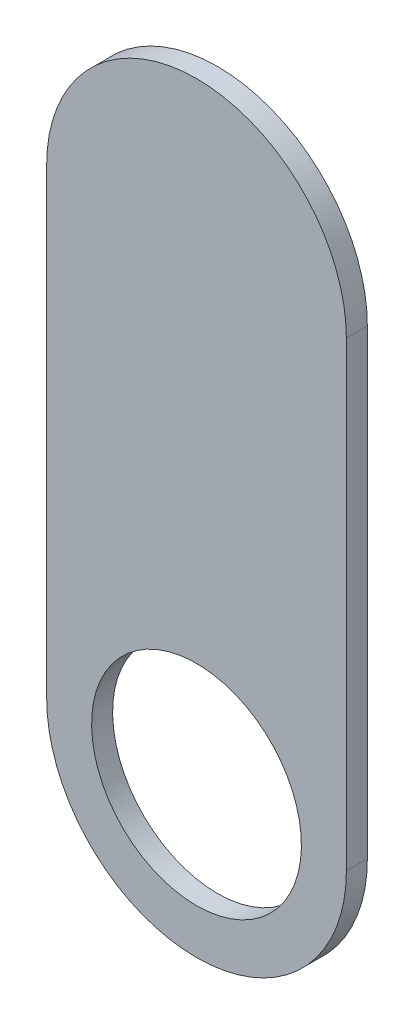
ISO-10303-21;
HEADER;
FILE_DESCRIPTION(('STEP AP214'),'2;1');
FILE_NAME('part.step','',(''),(''),'','','');
FILE_SCHEMA(('AUTOMOTIVE_DESIGN { 1 0 10303 214 1 1 1 1 }'));
ENDSEC;
DATA;
#1=APPLICATION_CONTEXT('core data for automotive mechanical design processes');
#2=APPLICATION_PROTOCOL_DEFINITION('international standard','automotive_design',2000,#1);
#3=PRODUCT_CONTEXT('',#1,'mechanical');
#4=PRODUCT('Part','Part','',(#3));
#5=PRODUCT_RELATED_PRODUCT_CATEGORY('part','',(#4));
#6=PRODUCT_DEFINITION_FORMATION('','',#4);
#7=PRODUCT_DEFINITION_CONTEXT('part definition',#1,'design');
#8=PRODUCT_DEFINITION('design','',#6,#7);
#9=PRODUCT_DEFINITION_SHAPE('','',#8);
#10=(LENGTH_UNIT() NAMED_UNIT(*) SI_UNIT(.MILLI.,.METRE.));
#11=(NAMED_UNIT(*) PLANE_ANGLE_UNIT() SI_UNIT($,.RADIAN.));
#12=(NAMED_UNIT(*) SI_UNIT($,.STERADIAN.) SOLID_ANGLE_UNIT());
#13=UNCERTAINTY_MEASURE_WITH_UNIT(LENGTH_MEASURE(1.E-05),#10,'distance_accuracy_value','');
#14=(GEOMETRIC_REPRESENTATION_CONTEXT(3) GLOBAL_UNCERTAINTY_ASSIGNED_CONTEXT((#13)) GLOBAL_UNIT_ASSIGNED_CONTEXT((#10,
#11,#12)) REPRESENTATION_CONTEXT('',''));
#15=CARTESIAN_POINT('',(0.,0.,0.));
#16=DIRECTION('',(0.,0.,1.));
#17=DIRECTION('',(1.,0.,0.));
#18=AXIS2_PLACEMENT_3D('',#15,#16,#17);
#19=CARTESIAN_POINT('',(107.76,-108.63,-0.045));
#20=DIRECTION('',(0.,0.,-1.));
#21=DIRECTION('',(0.,-1.,0.));
#22=AXIS2_PLACEMENT_3D('',#19,#20,#21);
#23=CYLINDRICAL_SURFACE('',#22,0.175);
#24=CARTESIAN_POINT('',(107.76,-108.63,1.6));
#25=DIRECTION('',(0.,0.,-1.));
#26=DIRECTION('',(0.,-1.,0.));
#27=AXIS2_PLACEMENT_3D('',#24,#25,#26);
#28=CIRCLE('',#27,0.175);
#29=CARTESIAN_POINT('',(107.76,-108.805,1.6));
#30=VERTEX_POINT('',#29);
#31=EDGE_CURVE('E116',#30,#30,#28,.T.);
#32=ORIENTED_EDGE('',*,*,#31,.T.);
#33=DIRECTION('',(0.,0.,1.));
#34=VECTOR('',#33,1.);
#35=CARTESIAN_POINT('',(107.76,-108.805,-0.045));
#36=LINE('',#35,#34);
#37=CARTESIAN_POINT('',(107.76,-108.805,1.635));
#38=VERTEX_POINT('',#37);
#39=EDGE_CURVE('E11',#30,#38,#36,.T.);
#40=ORIENTED_EDGE('',*,*,#39,.T.);
#41=CARTESIAN_POINT('',(107.76,-108.63,1.635));
#42=DIRECTION('',(0.,0.,-1.));
#43=DIRECTION('',(0.,-1.,0.));
#44=AXIS2_PLACEMENT_3D('',#41,#42,#43);
#45=CIRCLE('',#44,0.175);
#46=EDGE_CURVE('E25',#38,#38,#45,.T.);
#47=ORIENTED_EDGE('',*,*,#46,.F.);
#48=ORIENTED_EDGE('',*,*,#39,.F.);
#49=EDGE_LOOP('',(#32,#40,#47,#48));
#50=FACE_BOUND('',#49,.T.);
#51=ADVANCED_FACE('F17',(#50),#23,.F.);
#52=CARTESIAN_POINT('',(107.51,-107.86,1.6));
#53=DIRECTION('',(1.,0.,0.));
#54=DIRECTION('',(0.,1.,0.));
#55=AXIS2_PLACEMENT_3D('',#52,#53,#54);
#56=PLANE('',#55);
#57=DIRECTION('',(0.,-1.,0.));
#58=VECTOR('',#57,1.);
#59=CARTESIAN_POINT('',(107.51,-107.86,1.6));
#60=LINE('',#59,#58);
#61=CARTESIAN_POINT('',(107.51,-107.86,1.6));
#62=VERTEX_POINT('',#61);
#63=CARTESIAN_POINT('',(107.51,-108.63,1.6));
#64=VERTEX_POINT('',#63);
#65=EDGE_CURVE('E114',#62,#64,#60,.T.);
#66=ORIENTED_EDGE('',*,*,#65,.T.);
#67=DIRECTION('',(0.,0.,1.));
#68=VECTOR('',#67,1.);
#69=CARTESIAN_POINT('',(107.51,-108.63,1.6));
#70=LINE('',#69,#68);
#71=CARTESIAN_POINT('',(107.51,-108.63,1.635));
#72=VERTEX_POINT('',#71);
#73=EDGE_CURVE('E83',#64,#72,#70,.T.);
#74=ORIENTED_EDGE('',*,*,#73,.T.);
#75=DIRECTION('',(0.,-1.,0.));
#76=VECTOR('',#75,1.);
#77=CARTESIAN_POINT('',(107.51,-107.86,1.635));
#78=LINE('',#77,#76);
#79=CARTESIAN_POINT('',(107.51,-107.86,1.635));
#80=VERTEX_POINT('',#79);
#81=EDGE_CURVE('E127',#80,#72,#78,.T.);
#82=ORIENTED_EDGE('',*,*,#81,.F.);
#83=DIRECTION('',(0.,0.,1.));
#84=VECTOR('',#83,1.);
#85=CARTESIAN_POINT('',(107.51,-107.86,1.6));
#86=LINE('',#85,#84);
#87=EDGE_CURVE('E112',#62,#80,#86,.T.);
#88=ORIENTED_EDGE('',*,*,#87,.F.);
#89=EDGE_LOOP('',(#66,#74,#82,#88));
#90=FACE_BOUND('',#89,.T.);
#91=ADVANCED_FACE('F153',(#90),#56,.F.);
#92=CARTESIAN_POINT('',(108.01,-108.63,1.635));
#93=DIRECTION('',(0.,0.,1.));
#94=DIRECTION('',(1.,0.,0.));
#95=AXIS2_PLACEMENT_3D('',#92,#93,#94);
#96=PLANE('',#95);
#97=ORIENTED_EDGE('',*,*,#46,.T.);
#98=EDGE_LOOP('',(#97));
#99=FACE_BOUND('',#98,.T.);
#100=DIRECTION('',(0.,1.,0.));
#101=VECTOR('',#100,1.);
#102=CARTESIAN_POINT('',(108.01,-108.63,1.635));
#103=LINE('',#102,#101);
#104=CARTESIAN_POINT('',(108.01,-108.63,1.635));
#105=VERTEX_POINT('',#104);
#106=CARTESIAN_POINT('',(108.01,-107.86,1.635));
#107=VERTEX_POINT('',#106);
#108=EDGE_CURVE('E95',#105,#107,#103,.T.);
#109=ORIENTED_EDGE('',*,*,#108,.T.);
#110=CARTESIAN_POINT('',(107.76,-107.86,1.635));
#111=DIRECTION('',(0.,0.,1.));
#112=DIRECTION('',(1.,0.,0.));
#113=AXIS2_PLACEMENT_3D('',#110,#111,#112);
#114=CIRCLE('',#113,0.25);
#115=EDGE_CURVE('E117',#107,#80,#114,.T.);
#116=ORIENTED_EDGE('',*,*,#115,.T.);
#117=ORIENTED_EDGE('',*,*,#81,.T.);
#118=CARTESIAN_POINT('',(107.76,-108.63,1.635));
#119=DIRECTION('',(0.,0.,1.));
#120=DIRECTION('',(-1.,0.,0.));
#121=AXIS2_PLACEMENT_3D('',#118,#119,#120);
#122=CIRCLE('',#121,0.25);
#123=EDGE_CURVE('E87',#72,#105,#122,.T.);
#124=ORIENTED_EDGE('',*,*,#123,.T.);
#125=EDGE_LOOP('',(#109,#116,#117,#124));
#126=FACE_BOUND('',#125,.T.);
#127=ADVANCED_FACE('F143',(#99,#126),#96,.T.);
#128=CARTESIAN_POINT('',(108.01,-108.63,1.6));
#129=DIRECTION('',(0.,0.,1.));
#130=DIRECTION('',(1.,0.,0.));
#131=AXIS2_PLACEMENT_3D('',#128,#129,#130);
#132=PLANE('',#131);
#133=ORIENTED_EDGE('',*,*,#31,.F.);
#134=EDGE_LOOP('',(#133));
#135=FACE_BOUND('',#134,.T.);
#136=CARTESIAN_POINT('',(107.76,-108.63,1.6));
#137=DIRECTION('',(0.,0.,1.));
#138=DIRECTION('',(-1.,0.,0.));
#139=AXIS2_PLACEMENT_3D('',#136,#137,#138);
#140=CIRCLE('',#139,0.25);
#141=CARTESIAN_POINT('',(108.01,-108.63,1.6));
#142=VERTEX_POINT('',#141);
#143=EDGE_CURVE('E76',#64,#142,#140,.T.);
#144=ORIENTED_EDGE('',*,*,#143,.F.);
#145=ORIENTED_EDGE('',*,*,#65,.F.);
#146=CARTESIAN_POINT('',(107.76,-107.86,1.6));
#147=DIRECTION('',(0.,0.,1.));
#148=DIRECTION('',(1.,0.,0.));
#149=AXIS2_PLACEMENT_3D('',#146,#147,#148);
#150=CIRCLE('',#149,0.25);
#151=CARTESIAN_POINT('',(108.01,-107.86,1.6));
#152=VERTEX_POINT('',#151);
#153=EDGE_CURVE('E100',#152,#62,#150,.T.);
#154=ORIENTED_EDGE('',*,*,#153,.F.);
#155=DIRECTION('',(0.,1.,0.));
#156=VECTOR('',#155,1.);
#157=CARTESIAN_POINT('',(108.01,-108.63,1.6));
#158=LINE('',#157,#156);
#159=EDGE_CURVE('E93',#142,#152,#158,.T.);
#160=ORIENTED_EDGE('',*,*,#159,.F.);
#161=EDGE_LOOP('',(#144,#145,#154,#160));
#162=FACE_BOUND('',#161,.T.);
#163=ADVANCED_FACE('F98',(#135,#162),#132,.F.);
#164=CARTESIAN_POINT('',(107.76,-107.86,1.6));
#165=DIRECTION('',(0.,0.,-1.));
#166=DIRECTION('',(1.,0.,0.));
#167=AXIS2_PLACEMENT_3D('',#164,#165,#166);
#168=CYLINDRICAL_SURFACE('',#167,0.25);
#169=ORIENTED_EDGE('',*,*,#153,.T.);
#170=ORIENTED_EDGE('',*,*,#87,.T.);
#171=ORIENTED_EDGE('',*,*,#115,.F.);
#172=DIRECTION('',(0.,0.,1.));
#173=VECTOR('',#172,1.);
#174=CARTESIAN_POINT('',(108.01,-107.86,1.6));
#175=LINE('',#174,#173);
#176=EDGE_CURVE('E103',#152,#107,#175,.T.);
#177=ORIENTED_EDGE('',*,*,#176,.F.);
#178=EDGE_LOOP('',(#169,#170,#171,#177));
#179=FACE_BOUND('',#178,.T.);
#180=ADVANCED_FACE('F142',(#179),#168,.T.);
#181=CARTESIAN_POINT('',(107.76,-108.63,1.6));
#182=DIRECTION('',(0.,0.,-1.));
#183=DIRECTION('',(-1.,0.,0.));
#184=AXIS2_PLACEMENT_3D('',#181,#182,#183);
#185=CYLINDRICAL_SURFACE('',#184,0.25);
#186=ORIENTED_EDGE('',*,*,#143,.T.);
#187=DIRECTION('',(0.,0.,1.));
#188=VECTOR('',#187,1.);
#189=CARTESIAN_POINT('',(108.01,-108.63,1.6));
#190=LINE('',#189,#188);
#191=EDGE_CURVE('E80',#142,#105,#190,.T.);
#192=ORIENTED_EDGE('',*,*,#191,.T.);
#193=ORIENTED_EDGE('',*,*,#123,.F.);
#194=ORIENTED_EDGE('',*,*,#73,.F.);
#195=EDGE_LOOP('',(#186,#192,#193,#194));
#196=FACE_BOUND('',#195,.T.);
#197=ADVANCED_FACE('F78',(#196),#185,.T.);
#198=CARTESIAN_POINT('',(108.01,-108.63,1.6));
#199=DIRECTION('',(-1.,0.,0.));
#200=DIRECTION('',(0.,0.,1.));
#201=AXIS2_PLACEMENT_3D('',#198,#199,#200);
#202=PLANE('',#201);
#203=ORIENTED_EDGE('',*,*,#159,.T.);
#204=ORIENTED_EDGE('',*,*,#176,.T.);
#205=ORIENTED_EDGE('',*,*,#108,.F.);
#206=ORIENTED_EDGE('',*,*,#191,.F.);
#207=EDGE_LOOP('',(#203,#204,#205,#206));
#208=FACE_BOUND('',#207,.T.);
#209=ADVANCED_FACE('F91',(#208),#202,.F.);
#210=CLOSED_SHELL('',(#51,#91,#127,#163,#180,#197,#209));
#211=MANIFOLD_SOLID_BREP('B1',#210);
#212=ADVANCED_BREP_SHAPE_REPRESENTATION('',(#18,#211),#14);
#213=SHAPE_DEFINITION_REPRESENTATION(#9,#212);
ENDSEC;
END-ISO-10303-21;
